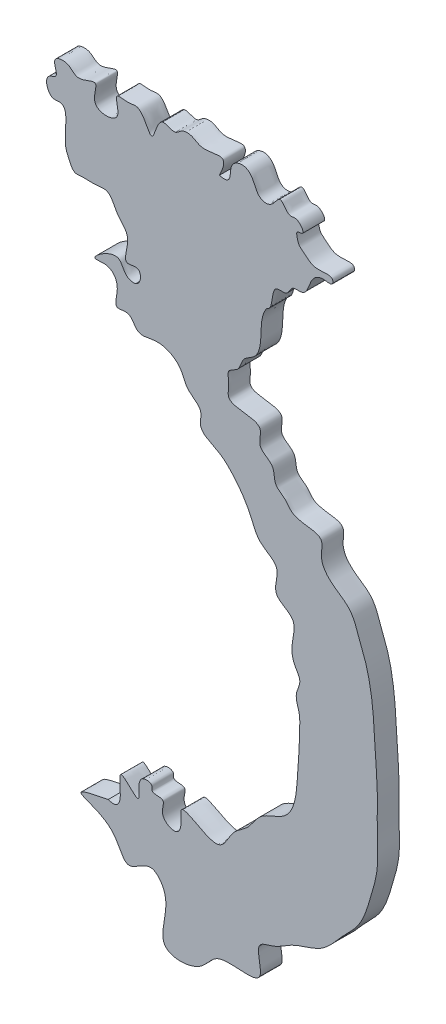
ISO-10303-21;
HEADER;
FILE_DESCRIPTION(('STEP AP214'),'2;1');
FILE_NAME('part.step','',(''),(''),'','','');
FILE_SCHEMA(('AUTOMOTIVE_DESIGN { 1 0 10303 214 1 1 1 1 }'));
ENDSEC;
DATA;
#1=APPLICATION_CONTEXT('core data for automotive mechanical design processes');
#2=APPLICATION_PROTOCOL_DEFINITION('international standard','automotive_design',2000,#1);
#3=PRODUCT_CONTEXT('',#1,'mechanical');
#4=PRODUCT('Part','Part','',(#3));
#5=PRODUCT_RELATED_PRODUCT_CATEGORY('part','',(#4));
#6=PRODUCT_DEFINITION_FORMATION('','',#4);
#7=PRODUCT_DEFINITION_CONTEXT('part definition',#1,'design');
#8=PRODUCT_DEFINITION('design','',#6,#7);
#9=PRODUCT_DEFINITION_SHAPE('','',#8);
#10=(LENGTH_UNIT() NAMED_UNIT(*) SI_UNIT(.MILLI.,.METRE.));
#11=(NAMED_UNIT(*) PLANE_ANGLE_UNIT() SI_UNIT($,.RADIAN.));
#12=(NAMED_UNIT(*) SI_UNIT($,.STERADIAN.) SOLID_ANGLE_UNIT());
#13=UNCERTAINTY_MEASURE_WITH_UNIT(LENGTH_MEASURE(1.E-05),#10,'distance_accuracy_value','');
#14=(GEOMETRIC_REPRESENTATION_CONTEXT(3) GLOBAL_UNCERTAINTY_ASSIGNED_CONTEXT((#13)) GLOBAL_UNIT_ASSIGNED_CONTEXT((#10,
#11,#12)) REPRESENTATION_CONTEXT('',''));
#15=CARTESIAN_POINT('',(0.,0.,0.));
#16=DIRECTION('',(0.,0.,1.));
#17=DIRECTION('',(1.,0.,0.));
#18=AXIS2_PLACEMENT_3D('',#15,#16,#17);
#19=CARTESIAN_POINT('',(-14.1181938718315,11.5795285922528,3.));
#20=CARTESIAN_POINT('',(-12.3000990015942,15.2623362293105,3.));
#21=CARTESIAN_POINT('',(-15.8642551953634,12.7384274545721,3.));
#22=CARTESIAN_POINT('',(-17.9225908087705,14.5375042823969,3.));
#23=CARTESIAN_POINT('',(-19.3582965851603,14.4709545471822,3.));
#24=CARTESIAN_POINT('',(-20.3442858674871,13.2204405822604,3.));
#25=CARTESIAN_POINT('',(-22.6304881844784,15.078396480592,3.));
#26=CARTESIAN_POINT('',(-23.3296008093311,9.497109548756,3.));
#27=CARTESIAN_POINT('',(-24.774561213807,14.5960676998151,3.));
#28=CARTESIAN_POINT('',(-26.7245823790991,13.8120101148724,3.));
#29=CARTESIAN_POINT('',(-29.0913759191801,14.4966925222131,3.));
#30=CARTESIAN_POINT('',(-26.9886167757636,10.6551605675082,3.));
#31=CARTESIAN_POINT('',(-32.5023440128924,10.6282115158947,3.));
#32=CARTESIAN_POINT('',(-30.2972383425083,15.1542410665826,3.));
#33=CARTESIAN_POINT('',(-33.8149709622772,12.7844571685643,3.));
#34=CARTESIAN_POINT('',(-34.8931029884361,14.7464692773752,3.));
#35=CARTESIAN_POINT('',(-37.6789856569617,14.3763727680318,3.));
#36=CARTESIAN_POINT('',(-36.082514388322,11.9776831594151,3.));
#37=CARTESIAN_POINT('',(-38.5876381074383,11.7688944672487,3.));
#38=CARTESIAN_POINT('',(-37.7249366350358,8.96348986107433,3.));
#39=CARTESIAN_POINT('',(-34.5594257834402,9.8137493752338,3.));
#40=CARTESIAN_POINT('',(-35.955662276926,5.20304775818831,3.));
#41=CARTESIAN_POINT('',(-34.9131465402104,3.07135315762988,3.));
#42=CARTESIAN_POINT('',(-34.3342695272302,1.69955123921028,3.));
#43=CARTESIAN_POINT('',(-32.7904120955212,1.99086662320747,3.));
#44=CARTESIAN_POINT('',(-31.4492062980083,1.76080365765486,3.));
#45=CARTESIAN_POINT('',(-29.2081911816069,2.26607853252188,3.));
#46=CARTESIAN_POINT('',(-28.4166183640961,-0.447587339819386,3.));
#47=CARTESIAN_POINT('',(-26.0147471933743,-1.91238797949709,3.));
#48=CARTESIAN_POINT('',(-27.8920849411347,-5.98940503275063,3.));
#49=CARTESIAN_POINT('',(-24.9126137849725,-4.72474333782389,3.));
#50=CARTESIAN_POINT('',(-24.9652935124271,-7.42165703801374,3.));
#51=CARTESIAN_POINT('',(-27.3933707138843,-7.19874459584619,3.));
#52=CARTESIAN_POINT('',(-27.74920880757,-3.88999112567928,3.));
#53=CARTESIAN_POINT('',(-32.7351427696527,-7.45626260674082,3.));
#54=CARTESIAN_POINT('',(-29.1553240889008,-6.64139109018101,3.));
#55=CARTESIAN_POINT('',(-27.7412636723278,-8.73129962991348,3.));
#56=CARTESIAN_POINT('',(-28.9761652678907,-11.8275755375134,3.));
#57=CARTESIAN_POINT('',(-26.3225456903259,-10.8332845717991,3.));
#58=CARTESIAN_POINT('',(-25.6646905472181,-13.3024824010558,3.));
#59=CARTESIAN_POINT('',(-23.5602292357538,-12.6972525833262,3.));
#60=CARTESIAN_POINT('',(-21.484081427409,-12.6510991969463,3.));
#61=CARTESIAN_POINT('',(-19.3255367258206,-13.9411618071841,3.));
#62=CARTESIAN_POINT('',(-18.7567059633472,-16.5242877841122,3.));
#63=CARTESIAN_POINT('',(-16.2352876435815,-17.5048152974886,3.));
#64=CARTESIAN_POINT('',(-17.2415975435953,-20.4638703583089,3.));
#65=CARTESIAN_POINT('',(-14.3916905497908,-21.3162665922249,3.));
#66=CARTESIAN_POINT('',(-11.9393807616379,-23.5509816434293,3.));
#67=CARTESIAN_POINT('',(-9.91474426394197,-26.3121498150869,3.));
#68=CARTESIAN_POINT('',(-8.79352118296116,-29.882547204994,3.));
#69=CARTESIAN_POINT('',(-5.2500112238822,-31.1140854116203,3.));
#70=CARTESIAN_POINT('',(-7.27783667873417,-35.0409705153919,3.));
#71=CARTESIAN_POINT('',(-3.19966309962627,-36.1651609823778,3.));
#72=CARTESIAN_POINT('',(-4.19398087636818,-39.3406324238072,3.));
#73=CARTESIAN_POINT('',(-4.06635614759248,-41.6718017041348,3.));
#74=CARTESIAN_POINT('',(-2.56345139868442,-43.4514710996522,3.));
#75=CARTESIAN_POINT('',(-3.85703247110366,-45.3413724690732,3.));
#76=CARTESIAN_POINT('',(-2.92785549652509,-47.3013027761567,3.));
#77=CARTESIAN_POINT('',(-3.0276371004714,-49.5860224215174,3.));
#78=CARTESIAN_POINT('',(-3.08372542625147,-52.0957333822785,3.));
#79=CARTESIAN_POINT('',(-3.34161138237733,-54.8589270526115,3.));
#80=CARTESIAN_POINT('',(-3.43362892653309,-57.7354174213025,3.));
#81=CARTESIAN_POINT('',(-4.68037672930885,-61.2368221000402,3.));
#82=CARTESIAN_POINT('',(-8.54844962431518,-61.7448590463604,3.));
#83=CARTESIAN_POINT('',(-9.9600492281925,-64.7950725574203,3.));
#84=CARTESIAN_POINT('',(-12.6030145636475,-65.9940181955609,3.));
#85=CARTESIAN_POINT('',(-13.9583174424317,-70.7918537654387,3.));
#86=CARTESIAN_POINT('',(-19.9999949699265,-65.3163451065317,3.));
#87=CARTESIAN_POINT('',(-19.2676656696584,-68.7123008417159,3.));
#88=CARTESIAN_POINT('',(-19.9196121796907,-70.7301012276564,3.));
#89=CARTESIAN_POINT('',(-22.7054698818306,-69.2346670323262,3.));
#90=CARTESIAN_POINT('',(-21.2715525223615,-66.7472475936649,3.));
#91=CARTESIAN_POINT('',(-23.6519588075344,-67.2449607626093,3.));
#92=CARTESIAN_POINT('',(-23.2636883880033,-65.9310306827575,3.));
#93=CARTESIAN_POINT('',(-25.9697888839973,-65.5888345692612,3.));
#94=CARTESIAN_POINT('',(-24.3295208226865,-70.7448612972695,3.));
#95=CARTESIAN_POINT('',(-29.5453445592615,-63.9751872083139,3.));
#96=CARTESIAN_POINT('',(-26.6952263990292,-71.9595529933854,3.));
#97=CARTESIAN_POINT('',(-29.5007123035503,-70.9024543166805,3.));
#98=B_SPLINE_CURVE_WITH_KNOTS('',3,(#19,#20,#21,#22,#23,#24,#25,#26,#27,#28,#29,#30,#31,#32,#33,
#34,#35,#36,#37,#38,#39,#40,#41,#42,#43,#44,#45,#46,#47,#48,#49,#50,#51,#52,#53,#54,#55,#56,#57,
#58,#59,#60,#61,#62,#63,#64,#65,#66,#67,#68,#69,#70,#71,#72,#73,#74,#75,#76,#77,#78,#79,#80,#81,
#82,#83,#84,#85,#86,#87,#88,#89,#90,#91,#92,#93,#94,#95,#96,#97),.UNSPECIFIED.,.F.,.F.,(4,1,1,1,
1,1,1,1,1,1,1,1,1,1,1,1,1,1,1,1,1,1,1,1,1,1,1,1,1,1,1,1,1,1,1,1,1,1,1,1,1,1,1,1,1,1,1,1,1,1,1,1,
1,1,1,1,1,1,1,1,1,1,1,1,1,1,1,1,1,1,1,1,1,1,1,1,4),(0.,0.0285650039592336,0.0369325784885057,
0.0443760478458967,0.050112962910675,0.060348289200058,0.0761581280491509,0.0935182629622971,
0.10164941573521,0.109780568508124,0.123339158369088,0.14043297279459,0.153991562655554,
0.168102331322179,0.177352104873459,0.187472877340503,0.197913740834527,0.204385017996269,
0.217903591414814,0.222827216594618,0.251710365513872,0.258792752527323,0.267059660624774,
0.271983285804579,0.282661805850495,0.291677786523796,0.305314966338924,0.320926088552913,
0.33718839409874,0.345319546871653,0.354805891773385,0.362937044546299,0.375431298626118,
0.394980959267882,0.402766033646231,0.4181092029229,0.43030593208227,0.438437084855183,
0.449936271384365,0.460777808414916,0.468908961187829,0.486269708783048,0.496957684480336,
0.511946970926564,0.521433315828296,0.539170546234744,0.549881897167208,0.579580064267966,
0.595112422705266,0.611533075472723,0.629150573147369,0.645571225914826,0.661833531460653,
0.675390283976028,0.685528421825398,0.696145168058217,0.707748401608362,0.7194649498647,
0.734611442768622,0.750326083995726,0.766145995586076,0.784153128701684,0.806917102277741,
0.82246160740307,0.836556460044803,0.855115524431823,0.885222652728855,0.893991779069251,
0.901841226763765,0.915173260491595,0.923942386831991,0.932438042583271,0.934899855173173,
0.94243202516262,0.958079673552185,0.974446514878648,1.),.UNSPECIFIED.);
#99=DIRECTION('',(0.,0.,-1.));
#100=VECTOR('',#99,1.);
#101=SURFACE_OF_LINEAR_EXTRUSION('',#98,#100);
#102=CARTESIAN_POINT('',(-14.1181938718315,11.5795285922528,0.));
#103=CARTESIAN_POINT('',(-12.3000990015942,15.2623362293105,0.));
#104=CARTESIAN_POINT('',(-15.8642551953634,12.7384274545721,0.));
#105=CARTESIAN_POINT('',(-17.9225908087705,14.5375042823969,0.));
#106=CARTESIAN_POINT('',(-19.3582965851603,14.4709545471822,0.));
#107=CARTESIAN_POINT('',(-20.3442858674871,13.2204405822604,0.));
#108=CARTESIAN_POINT('',(-22.6304881844784,15.078396480592,0.));
#109=CARTESIAN_POINT('',(-23.3296008093311,9.497109548756,0.));
#110=CARTESIAN_POINT('',(-24.774561213807,14.5960676998151,0.));
#111=CARTESIAN_POINT('',(-26.7245823790991,13.8120101148724,0.));
#112=CARTESIAN_POINT('',(-29.0913759191801,14.4966925222131,0.));
#113=CARTESIAN_POINT('',(-26.9886167757636,10.6551605675082,0.));
#114=CARTESIAN_POINT('',(-32.5023440128924,10.6282115158947,0.));
#115=CARTESIAN_POINT('',(-30.2972383425083,15.1542410665826,0.));
#116=CARTESIAN_POINT('',(-33.8149709622772,12.7844571685643,0.));
#117=CARTESIAN_POINT('',(-34.8931029884361,14.7464692773752,0.));
#118=CARTESIAN_POINT('',(-37.6789856569617,14.3763727680318,0.));
#119=CARTESIAN_POINT('',(-36.082514388322,11.9776831594151,0.));
#120=CARTESIAN_POINT('',(-38.5876381074383,11.7688944672487,0.));
#121=CARTESIAN_POINT('',(-37.7249366350358,8.96348986107433,0.));
#122=CARTESIAN_POINT('',(-34.5594257834402,9.8137493752338,0.));
#123=CARTESIAN_POINT('',(-35.955662276926,5.20304775818831,0.));
#124=CARTESIAN_POINT('',(-34.9131465402104,3.07135315762988,0.));
#125=CARTESIAN_POINT('',(-34.3342695272302,1.69955123921028,0.));
#126=CARTESIAN_POINT('',(-32.7904120955212,1.99086662320747,0.));
#127=CARTESIAN_POINT('',(-31.4492062980083,1.76080365765486,0.));
#128=CARTESIAN_POINT('',(-29.2081911816069,2.26607853252188,0.));
#129=CARTESIAN_POINT('',(-28.4166183640961,-0.447587339819386,0.));
#130=CARTESIAN_POINT('',(-26.0147471933743,-1.91238797949709,0.));
#131=CARTESIAN_POINT('',(-27.8920849411347,-5.98940503275063,0.));
#132=CARTESIAN_POINT('',(-24.9126137849725,-4.72474333782389,0.));
#133=CARTESIAN_POINT('',(-24.9652935124271,-7.42165703801374,0.));
#134=CARTESIAN_POINT('',(-27.3933707138843,-7.19874459584619,0.));
#135=CARTESIAN_POINT('',(-27.74920880757,-3.88999112567928,0.));
#136=CARTESIAN_POINT('',(-32.7351427696527,-7.45626260674082,0.));
#137=CARTESIAN_POINT('',(-29.1553240889008,-6.64139109018101,0.));
#138=CARTESIAN_POINT('',(-27.7412636723278,-8.73129962991348,0.));
#139=CARTESIAN_POINT('',(-28.9761652678907,-11.8275755375134,0.));
#140=CARTESIAN_POINT('',(-26.3225456903259,-10.8332845717991,0.));
#141=CARTESIAN_POINT('',(-25.6646905472181,-13.3024824010558,0.));
#142=CARTESIAN_POINT('',(-23.5602292357538,-12.6972525833262,0.));
#143=CARTESIAN_POINT('',(-21.484081427409,-12.6510991969463,0.));
#144=CARTESIAN_POINT('',(-19.3255367258206,-13.9411618071841,0.));
#145=CARTESIAN_POINT('',(-18.7567059633472,-16.5242877841122,0.));
#146=CARTESIAN_POINT('',(-16.2352876435815,-17.5048152974886,0.));
#147=CARTESIAN_POINT('',(-17.2415975435953,-20.4638703583089,0.));
#148=CARTESIAN_POINT('',(-14.3916905497908,-21.3162665922249,0.));
#149=CARTESIAN_POINT('',(-11.9393807616379,-23.5509816434293,0.));
#150=CARTESIAN_POINT('',(-9.91474426394197,-26.3121498150869,0.));
#151=CARTESIAN_POINT('',(-8.79352118296116,-29.882547204994,0.));
#152=CARTESIAN_POINT('',(-5.2500112238822,-31.1140854116203,0.));
#153=CARTESIAN_POINT('',(-7.27783667873417,-35.0409705153919,0.));
#154=CARTESIAN_POINT('',(-3.19966309962627,-36.1651609823778,0.));
#155=CARTESIAN_POINT('',(-4.19398087636818,-39.3406324238072,0.));
#156=CARTESIAN_POINT('',(-4.06635614759248,-41.6718017041348,0.));
#157=CARTESIAN_POINT('',(-2.56345139868442,-43.4514710996522,0.));
#158=CARTESIAN_POINT('',(-3.85703247110366,-45.3413724690732,0.));
#159=CARTESIAN_POINT('',(-2.92785549652509,-47.3013027761567,0.));
#160=CARTESIAN_POINT('',(-3.0276371004714,-49.5860224215174,0.));
#161=CARTESIAN_POINT('',(-3.08372542625147,-52.0957333822785,0.));
#162=CARTESIAN_POINT('',(-3.34161138237733,-54.8589270526115,0.));
#163=CARTESIAN_POINT('',(-3.43362892653309,-57.7354174213025,0.));
#164=CARTESIAN_POINT('',(-4.68037672930885,-61.2368221000402,0.));
#165=CARTESIAN_POINT('',(-8.54844962431518,-61.7448590463604,0.));
#166=CARTESIAN_POINT('',(-9.9600492281925,-64.7950725574203,0.));
#167=CARTESIAN_POINT('',(-12.6030145636475,-65.9940181955609,0.));
#168=CARTESIAN_POINT('',(-13.9583174424317,-70.7918537654387,0.));
#169=CARTESIAN_POINT('',(-19.9999949699265,-65.3163451065317,0.));
#170=CARTESIAN_POINT('',(-19.2676656696584,-68.7123008417159,0.));
#171=CARTESIAN_POINT('',(-19.9196121796907,-70.7301012276564,0.));
#172=CARTESIAN_POINT('',(-22.7054698818306,-69.2346670323262,0.));
#173=CARTESIAN_POINT('',(-21.2715525223615,-66.7472475936649,0.));
#174=CARTESIAN_POINT('',(-23.6519588075344,-67.2449607626093,0.));
#175=CARTESIAN_POINT('',(-23.2636883880033,-65.9310306827575,0.));
#176=CARTESIAN_POINT('',(-25.9697888839973,-65.5888345692612,0.));
#177=CARTESIAN_POINT('',(-24.3295208226865,-70.7448612972695,0.));
#178=CARTESIAN_POINT('',(-29.5453445592615,-63.9751872083139,0.));
#179=CARTESIAN_POINT('',(-26.6952263990292,-71.9595529933854,0.));
#180=CARTESIAN_POINT('',(-29.5007123035503,-70.9024543166805,0.));
#181=B_SPLINE_CURVE_WITH_KNOTS('',3,(#102,#103,#104,#105,#106,#107,#108,#109,#110,#111,#112,
#113,#114,#115,#116,#117,#118,#119,#120,#121,#122,#123,#124,#125,#126,#127,#128,#129,#130,#131,
#132,#133,#134,#135,#136,#137,#138,#139,#140,#141,#142,#143,#144,#145,#146,#147,#148,#149,#150,
#151,#152,#153,#154,#155,#156,#157,#158,#159,#160,#161,#162,#163,#164,#165,#166,#167,#168,#169,
#170,#171,#172,#173,#174,#175,#176,#177,#178,#179,#180),.UNSPECIFIED.,.F.,.F.,(4,1,1,1,1,1,1,1,
1,1,1,1,1,1,1,1,1,1,1,1,1,1,1,1,1,1,1,1,1,1,1,1,1,1,1,1,1,1,1,1,1,1,1,1,1,1,1,1,1,1,1,1,1,1,1,1,
1,1,1,1,1,1,1,1,1,1,1,1,1,1,1,1,1,1,1,1,4),(0.,0.0285650039592336,0.0369325784885057,
0.0443760478458967,0.050112962910675,0.060348289200058,0.0761581280491509,0.0935182629622971,
0.10164941573521,0.109780568508124,0.123339158369088,0.14043297279459,0.153991562655554,
0.168102331322179,0.177352104873459,0.187472877340503,0.197913740834527,0.204385017996269,
0.217903591414814,0.222827216594618,0.251710365513872,0.258792752527323,0.267059660624774,
0.271983285804579,0.282661805850495,0.291677786523796,0.305314966338924,0.320926088552913,
0.33718839409874,0.345319546871653,0.354805891773385,0.362937044546299,0.375431298626118,
0.394980959267882,0.402766033646231,0.4181092029229,0.43030593208227,0.438437084855183,
0.449936271384365,0.460777808414916,0.468908961187829,0.486269708783048,0.496957684480336,
0.511946970926564,0.521433315828296,0.539170546234744,0.549881897167208,0.579580064267966,
0.595112422705266,0.611533075472723,0.629150573147369,0.645571225914826,0.661833531460653,
0.675390283976028,0.685528421825398,0.696145168058217,0.707748401608362,0.7194649498647,
0.734611442768622,0.750326083995726,0.766145995586076,0.784153128701684,0.806917102277741,
0.82246160740307,0.836556460044803,0.855115524431823,0.885222652728855,0.893991779069251,
0.901841226763765,0.915173260491595,0.923942386831991,0.932438042583271,0.934899855173173,
0.94243202516262,0.958079673552185,0.974446514878648,1.),.UNSPECIFIED.);
#182=CARTESIAN_POINT('',(-14.1181938718315,11.5795285922528,0.));
#183=VERTEX_POINT('',#182);
#184=CARTESIAN_POINT('',(-29.5007123035503,-70.9024543166805,0.));
#185=VERTEX_POINT('',#184);
#186=EDGE_CURVE('E79',#183,#185,#181,.T.);
#187=ORIENTED_EDGE('',*,*,#186,.T.);
#188=DIRECTION('',(0.,0.,-1.));
#189=VECTOR('',#188,1.);
#190=CARTESIAN_POINT('',(-29.5007123035503,-70.9024543166805,3.));
#191=LINE('',#190,#189);
#192=CARTESIAN_POINT('',(-29.5007123035503,-70.9024543166805,3.));
#193=VERTEX_POINT('',#192);
#194=EDGE_CURVE('E11',#193,#185,#191,.T.);
#195=ORIENTED_EDGE('',*,*,#194,.F.);
#196=CARTESIAN_POINT('',(-14.1181938718315,11.5795285922528,3.));
#197=VERTEX_POINT('',#196);
#198=EDGE_CURVE('E73',#197,#193,#98,.T.);
#199=ORIENTED_EDGE('',*,*,#198,.F.);
#200=DIRECTION('',(0.,0.,-1.));
#201=VECTOR('',#200,1.);
#202=CARTESIAN_POINT('',(-14.1181938718315,11.5795285922528,3.));
#203=LINE('',#202,#201);
#204=EDGE_CURVE('E80',#197,#183,#203,.T.);
#205=ORIENTED_EDGE('',*,*,#204,.T.);
#206=EDGE_LOOP('',(#187,#195,#199,#205));
#207=FACE_BOUND('',#206,.T.);
#208=ADVANCED_FACE('F32',(#207),#101,.F.);
#209=CARTESIAN_POINT('',(-29.5007123035503,-70.9024543166805,3.));
#210=CARTESIAN_POINT('',(-37.1287758748276,-72.3920089207682,3.));
#211=CARTESIAN_POINT('',(-28.8579745432076,-71.5790327979034,3.));
#212=CARTESIAN_POINT('',(-27.1436010463363,-78.8693029828603,3.));
#213=CARTESIAN_POINT('',(-23.8544363706411,-75.2364823805267,3.));
#214=CARTESIAN_POINT('',(-21.5409056652399,-77.7067463933694,3.));
#215=CARTESIAN_POINT('',(-21.3808151277853,-80.6245402644248,3.));
#216=CARTESIAN_POINT('',(-22.9093786324055,-85.6585736137152,3.));
#217=CARTESIAN_POINT('',(-16.5039791924468,-85.445099081301,3.));
#218=CARTESIAN_POINT('',(-14.4611705990582,-80.87887164359,3.));
#219=CARTESIAN_POINT('',(-8.3000369301415,-83.2648755657659,3.));
#220=CARTESIAN_POINT('',(-8.4832256048595,-79.8875858721185,3.));
#221=CARTESIAN_POINT('',(-9.19841528296942,-77.6149338545081,3.));
#222=CARTESIAN_POINT('',(-6.20922497003598,-77.1215592401675,3.));
#223=CARTESIAN_POINT('',(-3.89701086237819,-75.1917973545342,3.));
#224=CARTESIAN_POINT('',(0.232598787818003,-74.5104655368089,3.));
#225=CARTESIAN_POINT('',(2.62902262708857,-71.2127941485555,3.));
#226=CARTESIAN_POINT('',(5.58965153455378,-68.5711127000089,3.));
#227=CARTESIAN_POINT('',(6.73967869926553,-64.6573446389398,3.));
#228=CARTESIAN_POINT('',(7.97643782303492,-60.5935072223228,3.));
#229=CARTESIAN_POINT('',(7.61900032837051,-56.1052636317647,3.));
#230=CARTESIAN_POINT('',(7.83158899594631,-51.7078164132735,3.));
#231=CARTESIAN_POINT('',(7.46349120069813,-47.3843570743771,3.));
#232=CARTESIAN_POINT('',(7.27141768991829,-43.3697735350747,3.));
#233=CARTESIAN_POINT('',(6.90310805879441,-39.7418892166604,3.));
#234=CARTESIAN_POINT('',(6.20184698427987,-36.7490766464909,3.));
#235=CARTESIAN_POINT('',(5.11675817748418,-34.1765247882184,3.));
#236=CARTESIAN_POINT('',(4.29896515240219,-31.2162816675738,3.));
#237=CARTESIAN_POINT('',(1.40360659145313,-29.7727840366689,3.));
#238=CARTESIAN_POINT('',(-0.376274317920346,-27.5675687941679,3.));
#239=CARTESIAN_POINT('',(0.706497141484484,-23.9070023654892,3.));
#240=CARTESIAN_POINT('',(-3.7354877667408,-24.809768974974,3.));
#241=CARTESIAN_POINT('',(-4.92978081842541,-22.5496516028043,3.));
#242=CARTESIAN_POINT('',(-6.71612977010684,-21.7848669314509,3.));
#243=CARTESIAN_POINT('',(-6.3104076726313,-19.2493641131365,3.));
#244=CARTESIAN_POINT('',(-9.10208678234568,-18.4486533907253,3.));
#245=CARTESIAN_POINT('',(-7.45937038715918,-14.5404139041232,3.));
#246=CARTESIAN_POINT('',(-13.5757871802788,-15.7463426586567,3.));
#247=CARTESIAN_POINT('',(-12.6295008532083,-12.7884942027196,3.));
#248=CARTESIAN_POINT('',(-13.2276729389102,-11.0607923157193,3.));
#249=CARTESIAN_POINT('',(-11.2148890355057,-10.5685217868358,3.));
#250=CARTESIAN_POINT('',(-11.0656975686838,-8.57247847779833,3.));
#251=CARTESIAN_POINT('',(-8.8232386048195,-7.82618840561944,3.));
#252=CARTESIAN_POINT('',(-8.16126500914329,-4.63276533097809,3.));
#253=CARTESIAN_POINT('',(-8.47578615877998,-2.3789002219062,3.));
#254=CARTESIAN_POINT('',(-7.56976214169569,-1.09392485209625,3.));
#255=B_SPLINE_CURVE_WITH_KNOTS('',3,(#209,#210,#211,#212,#213,#214,#215,#216,#217,#218,#219,
#220,#221,#222,#223,#224,#225,#226,#227,#228,#229,#230,#231,#232,#233,#234,#235,#236,#237,#238,
#239,#240,#241,#242,#243,#244,#245,#246,#247,#248,#249,#250,#251,#252,#253,#254),.UNSPECIFIED.,
.F.,.F.,(4,1,1,1,1,1,1,1,1,1,1,1,1,1,1,1,1,1,1,1,1,1,1,1,1,1,1,1,1,1,1,1,1,1,1,1,1,1,1,1,1,1,1,
4),(0.,0.0634833011151714,0.0895202422723393,0.113485341026815,0.127013832308674,
0.149796653422025,0.179114359378801,0.213757275657374,0.237442258256582,0.279965318042897,
0.286893901298612,0.305947505251827,0.319139668301309,0.341148965658791,0.373126779180918,
0.40268957117932,0.425993209754628,0.457838323081483,0.488088949220734,0.517535428057522,
0.553910490150024,0.583407870457538,0.611176280279179,0.640825840686852,0.66225130113625,
0.677050761457893,0.701851315277227,0.724193473623553,0.744409904287987,0.758267070799416,
0.789629090490224,0.798835762901622,0.811839899107995,0.826166579884465,0.843314359062905,
0.857171525574334,0.890786044517641,0.902911065215142,0.913303940098714,0.923579219289752,
0.937394897782919,0.949641283652723,0.968636213267862,1.),.UNSPECIFIED.);
#256=DIRECTION('',(0.,0.,-1.));
#257=VECTOR('',#256,1.);
#258=SURFACE_OF_LINEAR_EXTRUSION('',#255,#257);
#259=CARTESIAN_POINT('',(-29.5007123035503,-70.9024543166805,0.));
#260=CARTESIAN_POINT('',(-37.1287758748276,-72.3920089207682,0.));
#261=CARTESIAN_POINT('',(-28.8579745432076,-71.5790327979034,0.));
#262=CARTESIAN_POINT('',(-27.1436010463363,-78.8693029828603,0.));
#263=CARTESIAN_POINT('',(-23.8544363706411,-75.2364823805267,0.));
#264=CARTESIAN_POINT('',(-21.5409056652399,-77.7067463933694,0.));
#265=CARTESIAN_POINT('',(-21.3808151277853,-80.6245402644248,0.));
#266=CARTESIAN_POINT('',(-22.9093786324055,-85.6585736137152,0.));
#267=CARTESIAN_POINT('',(-16.5039791924468,-85.445099081301,0.));
#268=CARTESIAN_POINT('',(-14.4611705990582,-80.87887164359,0.));
#269=CARTESIAN_POINT('',(-8.3000369301415,-83.2648755657659,0.));
#270=CARTESIAN_POINT('',(-8.4832256048595,-79.8875858721185,0.));
#271=CARTESIAN_POINT('',(-9.19841528296942,-77.6149338545081,0.));
#272=CARTESIAN_POINT('',(-6.20922497003598,-77.1215592401675,0.));
#273=CARTESIAN_POINT('',(-3.89701086237819,-75.1917973545342,0.));
#274=CARTESIAN_POINT('',(0.232598787818003,-74.5104655368089,0.));
#275=CARTESIAN_POINT('',(2.62902262708857,-71.2127941485555,0.));
#276=CARTESIAN_POINT('',(5.58965153455378,-68.5711127000089,0.));
#277=CARTESIAN_POINT('',(6.73967869926553,-64.6573446389398,0.));
#278=CARTESIAN_POINT('',(7.97643782303492,-60.5935072223228,0.));
#279=CARTESIAN_POINT('',(7.61900032837051,-56.1052636317647,0.));
#280=CARTESIAN_POINT('',(7.83158899594631,-51.7078164132735,0.));
#281=CARTESIAN_POINT('',(7.46349120069813,-47.3843570743771,0.));
#282=CARTESIAN_POINT('',(7.27141768991829,-43.3697735350747,0.));
#283=CARTESIAN_POINT('',(6.90310805879441,-39.7418892166604,0.));
#284=CARTESIAN_POINT('',(6.20184698427987,-36.7490766464909,0.));
#285=CARTESIAN_POINT('',(5.11675817748418,-34.1765247882184,0.));
#286=CARTESIAN_POINT('',(4.29896515240219,-31.2162816675738,0.));
#287=CARTESIAN_POINT('',(1.40360659145313,-29.7727840366689,0.));
#288=CARTESIAN_POINT('',(-0.376274317920346,-27.5675687941679,0.));
#289=CARTESIAN_POINT('',(0.706497141484484,-23.9070023654892,0.));
#290=CARTESIAN_POINT('',(-3.7354877667408,-24.809768974974,0.));
#291=CARTESIAN_POINT('',(-4.92978081842541,-22.5496516028043,0.));
#292=CARTESIAN_POINT('',(-6.71612977010684,-21.7848669314509,0.));
#293=CARTESIAN_POINT('',(-6.3104076726313,-19.2493641131365,0.));
#294=CARTESIAN_POINT('',(-9.10208678234568,-18.4486533907253,0.));
#295=CARTESIAN_POINT('',(-7.45937038715918,-14.5404139041232,0.));
#296=CARTESIAN_POINT('',(-13.5757871802788,-15.7463426586567,0.));
#297=CARTESIAN_POINT('',(-12.6295008532083,-12.7884942027196,0.));
#298=CARTESIAN_POINT('',(-13.2276729389102,-11.0607923157193,0.));
#299=CARTESIAN_POINT('',(-11.2148890355057,-10.5685217868358,0.));
#300=CARTESIAN_POINT('',(-11.0656975686838,-8.57247847779833,0.));
#301=CARTESIAN_POINT('',(-8.8232386048195,-7.82618840561944,0.));
#302=CARTESIAN_POINT('',(-8.16126500914329,-4.63276533097809,0.));
#303=CARTESIAN_POINT('',(-8.47578615877998,-2.3789002219062,0.));
#304=CARTESIAN_POINT('',(-7.56976214169569,-1.09392485209625,0.));
#305=B_SPLINE_CURVE_WITH_KNOTS('',3,(#259,#260,#261,#262,#263,#264,#265,#266,#267,#268,#269,
#270,#271,#272,#273,#274,#275,#276,#277,#278,#279,#280,#281,#282,#283,#284,#285,#286,#287,#288,
#289,#290,#291,#292,#293,#294,#295,#296,#297,#298,#299,#300,#301,#302,#303,#304),.UNSPECIFIED.,
.F.,.F.,(4,1,1,1,1,1,1,1,1,1,1,1,1,1,1,1,1,1,1,1,1,1,1,1,1,1,1,1,1,1,1,1,1,1,1,1,1,1,1,1,1,1,1,
4),(0.,0.0634833011151714,0.0895202422723393,0.113485341026815,0.127013832308674,
0.149796653422025,0.179114359378801,0.213757275657374,0.237442258256582,0.279965318042897,
0.286893901298612,0.305947505251827,0.319139668301309,0.341148965658791,0.373126779180918,
0.40268957117932,0.425993209754628,0.457838323081483,0.488088949220734,0.517535428057522,
0.553910490150024,0.583407870457538,0.611176280279179,0.640825840686852,0.66225130113625,
0.677050761457893,0.701851315277227,0.724193473623553,0.744409904287987,0.758267070799416,
0.789629090490224,0.798835762901622,0.811839899107995,0.826166579884465,0.843314359062905,
0.857171525574334,0.890786044517641,0.902911065215142,0.913303940098714,0.923579219289752,
0.937394897782919,0.949641283652723,0.968636213267862,1.),.UNSPECIFIED.);
#306=CARTESIAN_POINT('',(-7.56976214169569,-1.09392485209625,0.));
#307=VERTEX_POINT('',#306);
#308=EDGE_CURVE('E61',#185,#307,#305,.T.);
#309=ORIENTED_EDGE('',*,*,#308,.T.);
#310=DIRECTION('',(0.,0.,-1.));
#311=VECTOR('',#310,1.);
#312=CARTESIAN_POINT('',(-7.56976214169569,-1.09392485209625,3.));
#313=LINE('',#312,#311);
#314=CARTESIAN_POINT('',(-7.56976214169569,-1.09392485209625,3.));
#315=VERTEX_POINT('',#314);
#316=EDGE_CURVE('E41',#315,#307,#313,.T.);
#317=ORIENTED_EDGE('',*,*,#316,.F.);
#318=EDGE_CURVE('E69',#193,#315,#255,.T.);
#319=ORIENTED_EDGE('',*,*,#318,.F.);
#320=ORIENTED_EDGE('',*,*,#194,.T.);
#321=EDGE_LOOP('',(#309,#317,#319,#320));
#322=FACE_BOUND('',#321,.T.);
#323=ADVANCED_FACE('F70',(#322),#258,.F.);
#324=CARTESIAN_POINT('',(-7.56976214169569,-1.09392485209625,3.));
#325=CARTESIAN_POINT('',(-6.52947281520573,-0.873753771720005,3.));
#326=CARTESIAN_POINT('',(-7.30772795910318,2.56041519708521,3.));
#327=CARTESIAN_POINT('',(-4.61915504950183,1.69712126136334,3.));
#328=CARTESIAN_POINT('',(-4.19637285159349,3.51104966076789,3.));
#329=CARTESIAN_POINT('',(-2.5119578061946,2.95170471563865,3.));
#330=CARTESIAN_POINT('',(-1.80693727558062,4.17516615948671,3.));
#331=CARTESIAN_POINT('',(-1.42138814264186,5.46289462283397,3.));
#332=CARTESIAN_POINT('',(-0.299088449629706,6.69350830821213,3.));
#333=CARTESIAN_POINT('',(1.59012172018578,5.99169470511378,3.));
#334=CARTESIAN_POINT('',(1.58458148123085,7.29736686011249,3.));
#335=CARTESIAN_POINT('',(0.00792175797630676,7.09097469751432,3.));
#336=CARTESIAN_POINT('',(-1.35027647640395,7.16167752705067,3.));
#337=CARTESIAN_POINT('',(-2.32921030955488,8.06049597152819,3.));
#338=CARTESIAN_POINT('',(-3.16416052342917,8.68253051932671,3.));
#339=CARTESIAN_POINT('',(-3.3331519957521,9.39821923989123,3.));
#340=CARTESIAN_POINT('',(-3.6011735078031,10.3516215195765,3.));
#341=CARTESIAN_POINT('',(-2.01020909193855,10.1434084795972,3.));
#342=CARTESIAN_POINT('',(-3.27560534699472,11.9867009551588,3.));
#343=CARTESIAN_POINT('',(-4.69161784665003,11.2784608858005,3.));
#344=CARTESIAN_POINT('',(-5.69385155203102,13.8546647632271,3.));
#345=CARTESIAN_POINT('',(-6.72061397283341,11.3138265637986,3.));
#346=CARTESIAN_POINT('',(-8.98443115694269,11.5057468088225,3.));
#347=CARTESIAN_POINT('',(-9.26528170534632,13.5106733012916,3.));
#348=CARTESIAN_POINT('',(-10.8210919607197,14.688383101806,3.));
#349=CARTESIAN_POINT('',(-13.3737250212725,13.6787166643613,3.));
#350=CARTESIAN_POINT('',(-12.0645779686872,11.0481194946746,3.));
#351=CARTESIAN_POINT('',(-14.1181938718315,11.5795285922528,3.));
#352=B_SPLINE_CURVE_WITH_KNOTS('',3,(#324,#325,#326,#327,#328,#329,#330,#331,#332,#333,#334,
#335,#336,#337,#338,#339,#340,#341,#342,#343,#344,#345,#346,#347,#348,#349,#350,#351),
.UNSPECIFIED.,.F.,.F.,(4,1,1,1,1,1,1,1,1,1,1,1,1,1,1,1,1,1,1,1,1,1,1,1,1,4),(0.,
0.0905338358135245,0.12741703936466,0.163147356798688,0.200030560349823,0.235760877783851,
0.260396920929442,0.314024374176583,0.353619715358522,0.362769312085051,0.4031497204969,
0.441862382379799,0.481216285931738,0.507095253493544,0.521562036157471,0.544436027973795,
0.563298404841439,0.60532990932969,0.628203901146014,0.677724722011916,0.727245542877819,
0.763843929783938,0.830938417943617,0.863927758090937,0.911957458733104,1.),.UNSPECIFIED.);
#353=DIRECTION('',(0.,0.,-1.));
#354=VECTOR('',#353,1.);
#355=SURFACE_OF_LINEAR_EXTRUSION('',#352,#354);
#356=CARTESIAN_POINT('',(-7.56976214169569,-1.09392485209625,0.));
#357=CARTESIAN_POINT('',(-6.52947281520573,-0.873753771720005,0.));
#358=CARTESIAN_POINT('',(-7.30772795910318,2.56041519708521,0.));
#359=CARTESIAN_POINT('',(-4.61915504950183,1.69712126136334,0.));
#360=CARTESIAN_POINT('',(-4.19637285159349,3.51104966076789,0.));
#361=CARTESIAN_POINT('',(-2.5119578061946,2.95170471563865,0.));
#362=CARTESIAN_POINT('',(-1.80693727558062,4.17516615948671,0.));
#363=CARTESIAN_POINT('',(-1.42138814264186,5.46289462283397,0.));
#364=CARTESIAN_POINT('',(-0.299088449629706,6.69350830821213,0.));
#365=CARTESIAN_POINT('',(1.59012172018578,5.99169470511378,0.));
#366=CARTESIAN_POINT('',(1.58458148123085,7.29736686011249,0.));
#367=CARTESIAN_POINT('',(0.00792175797630676,7.09097469751432,0.));
#368=CARTESIAN_POINT('',(-1.35027647640395,7.16167752705067,0.));
#369=CARTESIAN_POINT('',(-2.32921030955488,8.06049597152819,0.));
#370=CARTESIAN_POINT('',(-3.16416052342917,8.68253051932671,0.));
#371=CARTESIAN_POINT('',(-3.3331519957521,9.39821923989123,0.));
#372=CARTESIAN_POINT('',(-3.6011735078031,10.3516215195765,0.));
#373=CARTESIAN_POINT('',(-2.01020909193855,10.1434084795972,0.));
#374=CARTESIAN_POINT('',(-3.27560534699472,11.9867009551588,0.));
#375=CARTESIAN_POINT('',(-4.69161784665003,11.2784608858005,0.));
#376=CARTESIAN_POINT('',(-5.69385155203102,13.8546647632271,0.));
#377=CARTESIAN_POINT('',(-6.72061397283341,11.3138265637986,0.));
#378=CARTESIAN_POINT('',(-8.98443115694269,11.5057468088225,0.));
#379=CARTESIAN_POINT('',(-9.26528170534632,13.5106733012916,0.));
#380=CARTESIAN_POINT('',(-10.8210919607197,14.688383101806,0.));
#381=CARTESIAN_POINT('',(-13.3737250212725,13.6787166643613,0.));
#382=CARTESIAN_POINT('',(-12.0645779686872,11.0481194946746,0.));
#383=CARTESIAN_POINT('',(-14.1181938718315,11.5795285922528,0.));
#384=B_SPLINE_CURVE_WITH_KNOTS('',3,(#356,#357,#358,#359,#360,#361,#362,#363,#364,#365,#366,
#367,#368,#369,#370,#371,#372,#373,#374,#375,#376,#377,#378,#379,#380,#381,#382,#383),
.UNSPECIFIED.,.F.,.F.,(4,1,1,1,1,1,1,1,1,1,1,1,1,1,1,1,1,1,1,1,1,1,1,1,1,4),(0.,
0.0905338358135245,0.12741703936466,0.163147356798688,0.200030560349823,0.235760877783851,
0.260396920929442,0.314024374176583,0.353619715358522,0.362769312085051,0.4031497204969,
0.441862382379799,0.481216285931738,0.507095253493544,0.521562036157471,0.544436027973795,
0.563298404841439,0.60532990932969,0.628203901146014,0.677724722011916,0.727245542877819,
0.763843929783938,0.830938417943617,0.863927758090937,0.911957458733104,1.),.UNSPECIFIED.);
#385=EDGE_CURVE('E66',#307,#183,#384,.T.);
#386=ORIENTED_EDGE('',*,*,#385,.T.);
#387=ORIENTED_EDGE('',*,*,#204,.F.);
#388=EDGE_CURVE('E49',#315,#197,#352,.T.);
#389=ORIENTED_EDGE('',*,*,#388,.F.);
#390=ORIENTED_EDGE('',*,*,#316,.T.);
#391=EDGE_LOOP('',(#386,#387,#389,#390));
#392=FACE_BOUND('',#391,.T.);
#393=ADVANCED_FACE('F105',(#392),#355,.F.);
#394=CARTESIAN_POINT('',(-18.158887987907,-16.51971855349,3.));
#395=DIRECTION('',(0.,0.,-1.));
#396=DIRECTION('',(-1.,0.,0.));
#397=AXIS2_PLACEMENT_3D('',#394,#395,#396);
#398=PLANE('',#397);
#399=ORIENTED_EDGE('',*,*,#198,.T.);
#400=ORIENTED_EDGE('',*,*,#318,.T.);
#401=ORIENTED_EDGE('',*,*,#388,.T.);
#402=EDGE_LOOP('',(#399,#400,#401));
#403=FACE_BOUND('',#402,.T.);
#404=ADVANCED_FACE('F76',(#403),#398,.F.);
#405=CARTESIAN_POINT('',(-18.158887987907,-16.51971855349,0.));
#406=DIRECTION('',(0.,0.,-1.));
#407=DIRECTION('',(-1.,0.,0.));
#408=AXIS2_PLACEMENT_3D('',#405,#406,#407);
#409=PLANE('',#408);
#410=ORIENTED_EDGE('',*,*,#186,.F.);
#411=ORIENTED_EDGE('',*,*,#385,.F.);
#412=ORIENTED_EDGE('',*,*,#308,.F.);
#413=EDGE_LOOP('',(#410,#411,#412));
#414=FACE_BOUND('',#413,.T.);
#415=ADVANCED_FACE('F106',(#414),#409,.T.);
#416=CLOSED_SHELL('',(#208,#323,#393,#404,#415));
#417=MANIFOLD_SOLID_BREP('B2',#416);
#418=ADVANCED_BREP_SHAPE_REPRESENTATION('',(#18,#417),#14);
#419=SHAPE_DEFINITION_REPRESENTATION(#9,#418);
ENDSEC;
END-ISO-10303-21;
